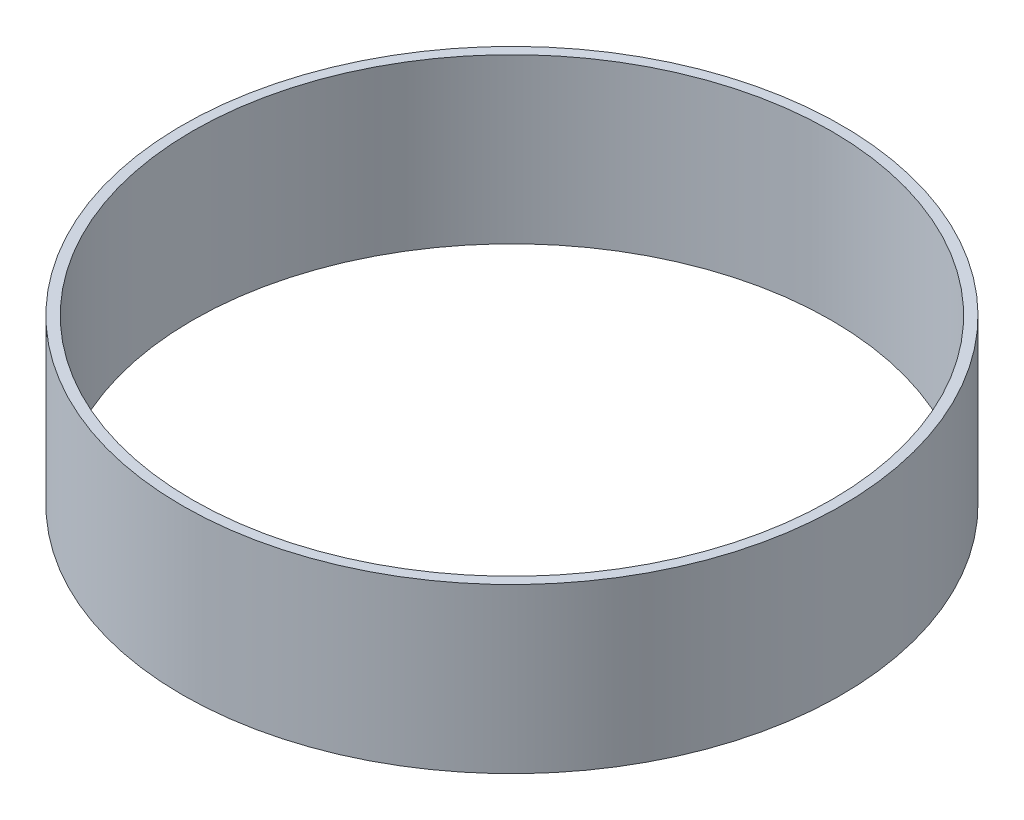
ISO-10303-21;
HEADER;
FILE_DESCRIPTION(('STEP AP214'),'2;1');
FILE_NAME('part.step','',(''),(''),'','','');
FILE_SCHEMA(('AUTOMOTIVE_DESIGN { 1 0 10303 214 1 1 1 1 }'));
ENDSEC;
DATA;
#1=APPLICATION_CONTEXT('core data for automotive mechanical design processes');
#2=APPLICATION_PROTOCOL_DEFINITION('international standard','automotive_design',2000,#1);
#3=PRODUCT_CONTEXT('',#1,'mechanical');
#4=PRODUCT('Part','Part','',(#3));
#5=PRODUCT_RELATED_PRODUCT_CATEGORY('part','',(#4));
#6=PRODUCT_DEFINITION_FORMATION('','',#4);
#7=PRODUCT_DEFINITION_CONTEXT('part definition',#1,'design');
#8=PRODUCT_DEFINITION('design','',#6,#7);
#9=PRODUCT_DEFINITION_SHAPE('','',#8);
#10=(LENGTH_UNIT() NAMED_UNIT(*) SI_UNIT(.MILLI.,.METRE.));
#11=(NAMED_UNIT(*) PLANE_ANGLE_UNIT() SI_UNIT($,.RADIAN.));
#12=(NAMED_UNIT(*) SI_UNIT($,.STERADIAN.) SOLID_ANGLE_UNIT());
#13=UNCERTAINTY_MEASURE_WITH_UNIT(LENGTH_MEASURE(1.E-05),#10,'distance_accuracy_value','');
#14=(GEOMETRIC_REPRESENTATION_CONTEXT(3) GLOBAL_UNCERTAINTY_ASSIGNED_CONTEXT((#13)) GLOBAL_UNIT_ASSIGNED_CONTEXT((#10,
#11,#12)) REPRESENTATION_CONTEXT('',''));
#15=CARTESIAN_POINT('',(0.,0.,0.));
#16=DIRECTION('',(0.,0.,1.));
#17=DIRECTION('',(1.,0.,0.));
#18=AXIS2_PLACEMENT_3D('',#15,#16,#17);
#19=CARTESIAN_POINT('',(0.,25.4,0.));
#20=DIRECTION('',(0.,1.,0.));
#21=DIRECTION('',(0.,0.,1.));
#22=AXIS2_PLACEMENT_3D('',#19,#20,#21);
#23=PLANE('',#22);
#24=CARTESIAN_POINT('',(0.,25.4,0.));
#25=DIRECTION('',(0.,1.,0.));
#26=DIRECTION('',(0.,0.,1.));
#27=AXIS2_PLACEMENT_3D('',#24,#25,#26);
#28=CIRCLE('',#27,51.1048);
#29=CARTESIAN_POINT('',(0.,25.4,51.1048));
#30=VERTEX_POINT('',#29);
#31=EDGE_CURVE('E10',#30,#30,#28,.T.);
#32=ORIENTED_EDGE('',*,*,#31,.T.);
#33=EDGE_LOOP('',(#32));
#34=FACE_BOUND('',#33,.T.);
#35=CARTESIAN_POINT('',(0.,25.4,0.));
#36=DIRECTION('',(0.,1.,0.));
#37=DIRECTION('',(0.,0.,1.));
#38=AXIS2_PLACEMENT_3D('',#35,#36,#37);
#39=CIRCLE('',#38,49.53);
#40=CARTESIAN_POINT('',(0.,25.4,49.53));
#41=VERTEX_POINT('',#40);
#42=EDGE_CURVE('E50',#41,#41,#39,.T.);
#43=ORIENTED_EDGE('',*,*,#42,.F.);
#44=EDGE_LOOP('',(#43));
#45=FACE_BOUND('',#44,.T.);
#46=ADVANCED_FACE('F39',(#34,#45),#23,.T.);
#47=CARTESIAN_POINT('',(0.,0.,0.));
#48=DIRECTION('',(0.,1.,0.));
#49=DIRECTION('',(0.,0.,1.));
#50=AXIS2_PLACEMENT_3D('',#47,#48,#49);
#51=PLANE('',#50);
#52=CARTESIAN_POINT('',(0.,0.,0.));
#53=DIRECTION('',(0.,1.,0.));
#54=DIRECTION('',(0.,0.,1.));
#55=AXIS2_PLACEMENT_3D('',#52,#53,#54);
#56=CIRCLE('',#55,51.1048);
#57=CARTESIAN_POINT('',(0.,0.,51.1048));
#58=VERTEX_POINT('',#57);
#59=EDGE_CURVE('E43',#58,#58,#56,.T.);
#60=ORIENTED_EDGE('',*,*,#59,.F.);
#61=EDGE_LOOP('',(#60));
#62=FACE_BOUND('',#61,.T.);
#63=CARTESIAN_POINT('',(0.,0.,0.));
#64=DIRECTION('',(0.,1.,0.));
#65=DIRECTION('',(0.,0.,1.));
#66=AXIS2_PLACEMENT_3D('',#63,#64,#65);
#67=CIRCLE('',#66,49.53);
#68=CARTESIAN_POINT('',(0.,0.,49.53));
#69=VERTEX_POINT('',#68);
#70=EDGE_CURVE('E52',#69,#69,#67,.T.);
#71=ORIENTED_EDGE('',*,*,#70,.T.);
#72=EDGE_LOOP('',(#71));
#73=FACE_BOUND('',#72,.T.);
#74=ADVANCED_FACE('F62',(#62,#73),#51,.F.);
#75=CARTESIAN_POINT('',(0.,25.4,0.));
#76=DIRECTION('',(0.,-1.,0.));
#77=DIRECTION('',(0.,0.,-1.));
#78=AXIS2_PLACEMENT_3D('',#75,#76,#77);
#79=CYLINDRICAL_SURFACE('',#78,51.1048);
#80=ORIENTED_EDGE('',*,*,#31,.F.);
#81=EDGE_LOOP('',(#80));
#82=FACE_BOUND('',#81,.T.);
#83=ORIENTED_EDGE('',*,*,#59,.T.);
#84=EDGE_LOOP('',(#83));
#85=FACE_BOUND('',#84,.T.);
#86=ADVANCED_FACE('F41',(#82,#85),#79,.T.);
#87=CARTESIAN_POINT('',(0.,25.4,0.));
#88=DIRECTION('',(0.,-1.,0.));
#89=DIRECTION('',(0.,0.,-1.));
#90=AXIS2_PLACEMENT_3D('',#87,#88,#89);
#91=CYLINDRICAL_SURFACE('',#90,49.53);
#92=ORIENTED_EDGE('',*,*,#42,.T.);
#93=EDGE_LOOP('',(#92));
#94=FACE_BOUND('',#93,.T.);
#95=ORIENTED_EDGE('',*,*,#70,.F.);
#96=EDGE_LOOP('',(#95));
#97=FACE_BOUND('',#96,.T.);
#98=ADVANCED_FACE('F58',(#94,#97),#91,.F.);
#99=CLOSED_SHELL('',(#46,#74,#86,#98));
#100=MANIFOLD_SOLID_BREP('B2',#99);
#101=ADVANCED_BREP_SHAPE_REPRESENTATION('',(#18,#100),#14);
#102=SHAPE_DEFINITION_REPRESENTATION(#9,#101);
ENDSEC;
END-ISO-10303-21;
